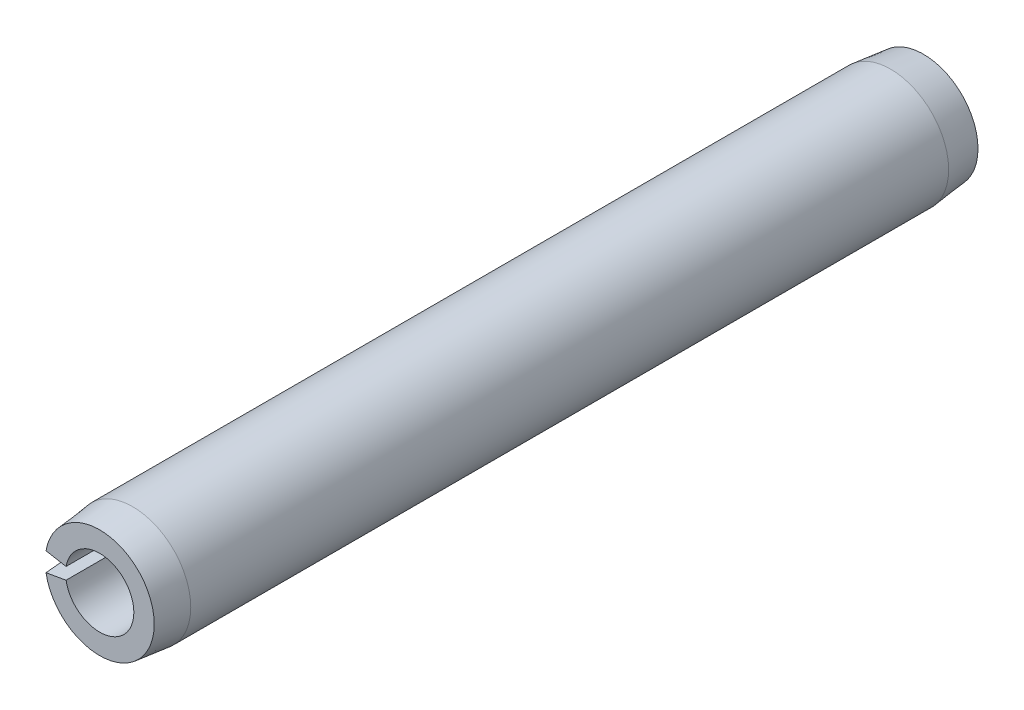
ISO-10303-21;
HEADER;
FILE_DESCRIPTION(('STEP AP214'),'2;1');
FILE_NAME('part.step','',(''),(''),'','','');
FILE_SCHEMA(('AUTOMOTIVE_DESIGN { 1 0 10303 214 1 1 1 1 }'));
ENDSEC;
DATA;
#1=APPLICATION_CONTEXT('core data for automotive mechanical design processes');
#2=APPLICATION_PROTOCOL_DEFINITION('international standard','automotive_design',2000,#1);
#3=PRODUCT_CONTEXT('',#1,'mechanical');
#4=PRODUCT('Part','Part','',(#3));
#5=PRODUCT_RELATED_PRODUCT_CATEGORY('part','',(#4));
#6=PRODUCT_DEFINITION_FORMATION('','',#4);
#7=PRODUCT_DEFINITION_CONTEXT('part definition',#1,'design');
#8=PRODUCT_DEFINITION('design','',#6,#7);
#9=PRODUCT_DEFINITION_SHAPE('','',#8);
#10=(LENGTH_UNIT() NAMED_UNIT(*) SI_UNIT(.MILLI.,.METRE.));
#11=(NAMED_UNIT(*) PLANE_ANGLE_UNIT() SI_UNIT($,.RADIAN.));
#12=(NAMED_UNIT(*) SI_UNIT($,.STERADIAN.) SOLID_ANGLE_UNIT());
#13=UNCERTAINTY_MEASURE_WITH_UNIT(LENGTH_MEASURE(1.E-05),#10,'distance_accuracy_value','');
#14=(GEOMETRIC_REPRESENTATION_CONTEXT(3) GLOBAL_UNCERTAINTY_ASSIGNED_CONTEXT((#13)) GLOBAL_UNIT_ASSIGNED_CONTEXT((#10,
#11,#12)) REPRESENTATION_CONTEXT('',''));
#15=CARTESIAN_POINT('',(0.,0.,0.));
#16=DIRECTION('',(0.,0.,1.));
#17=DIRECTION('',(1.,0.,0.));
#18=AXIS2_PLACEMENT_3D('',#15,#16,#17);
#19=CARTESIAN_POINT('',(0.,0.,17.4625));
#20=DIRECTION('',(0.,0.,1.));
#21=DIRECTION('',(1.,0.,0.));
#22=AXIS2_PLACEMENT_3D('',#19,#20,#21);
#23=PLANE('',#22);
#24=CARTESIAN_POINT('',(0.,0.,17.4625));
#25=DIRECTION('',(0.,0.,-1.));
#26=DIRECTION('',(-1.,0.,0.));
#27=AXIS2_PLACEMENT_3D('',#24,#25,#26);
#28=CIRCLE('',#27,2.3114);
#29=CARTESIAN_POINT('',(-2.27628464031242,0.401370397859335,17.4625));
#30=VERTEX_POINT('',#29);
#31=CARTESIAN_POINT('',(-2.27628464031242,-0.401370397859336,17.4625));
#32=VERTEX_POINT('',#31);
#33=EDGE_CURVE('E142',#30,#32,#28,.T.);
#34=ORIENTED_EDGE('',*,*,#33,.F.);
#35=DIRECTION('',(0.984807753012209,-0.173648177666927,0.));
#36=VECTOR('',#35,1.);
#37=CARTESIAN_POINT('',(-2.42636934187148,0.427834380135774,17.4625));
#38=LINE('',#37,#36);
#39=CARTESIAN_POINT('',(-1.42580466481108,0.251407831626177,17.4625));
#40=VERTEX_POINT('',#39);
#41=EDGE_CURVE('E166',#30,#40,#38,.T.);
#42=ORIENTED_EDGE('',*,*,#41,.T.);
#43=CARTESIAN_POINT('',(0.,0.,17.4625));
#44=DIRECTION('',(0.,0.,-1.));
#45=DIRECTION('',(1.,0.,0.));
#46=AXIS2_PLACEMENT_3D('',#43,#44,#45);
#47=CIRCLE('',#46,1.4478);
#48=CARTESIAN_POINT('',(-1.42580466481108,-0.251407831626177,17.4625));
#49=VERTEX_POINT('',#48);
#50=EDGE_CURVE('E164',#40,#49,#47,.T.);
#51=ORIENTED_EDGE('',*,*,#50,.T.);
#52=DIRECTION('',(-0.984807753012209,-0.173648177666927,0.));
#53=VECTOR('',#52,1.);
#54=CARTESIAN_POINT('',(-1.42580466481108,-0.251407831626177,17.4625));
#55=LINE('',#54,#53);
#56=EDGE_CURVE('E157',#49,#32,#55,.T.);
#57=ORIENTED_EDGE('',*,*,#56,.T.);
#58=EDGE_LOOP('',(#34,#42,#51,#57));
#59=FACE_BOUND('',#58,.T.);
#60=ADVANCED_FACE('F83',(#59),#23,.T.);
#61=CARTESIAN_POINT('',(0.,0.,-17.4625));
#62=DIRECTION('',(0.,0.,1.));
#63=DIRECTION('',(1.,0.,0.));
#64=AXIS2_PLACEMENT_3D('',#61,#62,#63);
#65=CYLINDRICAL_SURFACE('',#64,1.4478);
#66=DIRECTION('',(0.,0.,1.));
#67=VECTOR('',#66,1.);
#68=CARTESIAN_POINT('',(-1.42580466481108,-0.251407831626177,-17.4625));
#69=LINE('',#68,#67);
#70=CARTESIAN_POINT('',(-1.42580466481108,-0.251407831626177,-17.4625));
#71=VERTEX_POINT('',#70);
#72=EDGE_CURVE('E87',#71,#49,#69,.T.);
#73=ORIENTED_EDGE('',*,*,#72,.T.);
#74=ORIENTED_EDGE('',*,*,#50,.F.);
#75=DIRECTION('',(0.,0.,1.));
#76=VECTOR('',#75,1.);
#77=CARTESIAN_POINT('',(-1.42580466481108,0.251407831626177,-17.4625));
#78=LINE('',#77,#76);
#79=CARTESIAN_POINT('',(-1.42580466481108,0.251407831626177,-17.4625));
#80=VERTEX_POINT('',#79);
#81=EDGE_CURVE('E14',#80,#40,#78,.T.);
#82=ORIENTED_EDGE('',*,*,#81,.F.);
#83=CARTESIAN_POINT('',(0.,0.,-17.4625));
#84=DIRECTION('',(0.,0.,-1.));
#85=DIRECTION('',(1.,0.,0.));
#86=AXIS2_PLACEMENT_3D('',#83,#84,#85);
#87=CIRCLE('',#86,1.4478);
#88=EDGE_CURVE('E169',#80,#71,#87,.T.);
#89=ORIENTED_EDGE('',*,*,#88,.T.);
#90=EDGE_LOOP('',(#73,#74,#82,#89));
#91=FACE_BOUND('',#90,.T.);
#92=ADVANCED_FACE('F85',(#91),#65,.F.);
#93=CARTESIAN_POINT('',(-2.42636934187148,0.427834380135774,-17.4625));
#94=DIRECTION('',(-0.173648177666927,-0.984807753012209,0.));
#95=DIRECTION('',(0.984807753012209,-0.173648177666927,0.));
#96=AXIS2_PLACEMENT_3D('',#93,#94,#95);
#97=PLANE('',#96);
#98=DIRECTION('',(-0.106799948815622,0.0188317125144768,-0.994102176607995));
#99=VECTOR('',#98,1.);
#100=CARTESIAN_POINT('',(0.,0.,38.6503333333333));
#101=LINE('',#100,#99);
#102=CARTESIAN_POINT('',(-2.42636934187148,0.427834380135775,16.0655));
#103=VERTEX_POINT('',#102);
#104=EDGE_CURVE('E104',#103,#30,#101,.F.);
#105=ORIENTED_EDGE('',*,*,#104,.F.);
#106=DIRECTION('',(0.,0.,1.));
#107=VECTOR('',#106,1.);
#108=CARTESIAN_POINT('',(-2.42636934187148,0.427834380135774,-17.4625));
#109=LINE('',#108,#107);
#110=CARTESIAN_POINT('',(-2.42636934187148,0.427834380135775,-16.0655));
#111=VERTEX_POINT('',#110);
#112=EDGE_CURVE('E93',#111,#103,#109,.T.);
#113=ORIENTED_EDGE('',*,*,#112,.F.);
#114=DIRECTION('',(0.106799948815622,-0.0188317125144768,-0.994102176607995));
#115=VECTOR('',#114,1.);
#116=CARTESIAN_POINT('',(0.,0.,-38.6503333333333));
#117=LINE('',#116,#115);
#118=CARTESIAN_POINT('',(-2.27628464031242,0.401370397859335,-17.4625));
#119=VERTEX_POINT('',#118);
#120=EDGE_CURVE('E172',#119,#111,#117,.F.);
#121=ORIENTED_EDGE('',*,*,#120,.F.);
#122=DIRECTION('',(0.984807753012209,-0.173648177666927,0.));
#123=VECTOR('',#122,1.);
#124=CARTESIAN_POINT('',(-2.42636934187148,0.427834380135774,-17.4625));
#125=LINE('',#124,#123);
#126=EDGE_CURVE('E181',#119,#80,#125,.T.);
#127=ORIENTED_EDGE('',*,*,#126,.T.);
#128=ORIENTED_EDGE('',*,*,#81,.T.);
#129=ORIENTED_EDGE('',*,*,#41,.F.);
#130=EDGE_LOOP('',(#105,#113,#121,#127,#128,#129));
#131=FACE_BOUND('',#130,.T.);
#132=ADVANCED_FACE('F209',(#131),#97,.T.);
#133=CARTESIAN_POINT('',(0.,0.,-17.4625));
#134=DIRECTION('',(0.,0.,1.));
#135=DIRECTION('',(1.,0.,0.));
#136=AXIS2_PLACEMENT_3D('',#133,#134,#135);
#137=CYLINDRICAL_SURFACE('',#136,2.4638);
#138=CARTESIAN_POINT('',(0.,0.,16.0655));
#139=DIRECTION('',(0.,0.,-1.));
#140=DIRECTION('',(-1.,0.,0.));
#141=AXIS2_PLACEMENT_3D('',#138,#139,#140);
#142=CIRCLE('',#141,2.4638);
#143=CARTESIAN_POINT('',(-2.42636934187148,-0.427834380135775,16.0655));
#144=VERTEX_POINT('',#143);
#145=EDGE_CURVE('E151',#103,#144,#142,.T.);
#146=ORIENTED_EDGE('',*,*,#145,.T.);
#147=DIRECTION('',(0.,0.,1.));
#148=VECTOR('',#147,1.);
#149=CARTESIAN_POINT('',(-2.42636934187148,-0.427834380135775,-17.4625));
#150=LINE('',#149,#148);
#151=CARTESIAN_POINT('',(-2.42636934187148,-0.427834380135775,-16.0655));
#152=VERTEX_POINT('',#151);
#153=EDGE_CURVE('E160',#152,#144,#150,.T.);
#154=ORIENTED_EDGE('',*,*,#153,.F.);
#155=CARTESIAN_POINT('',(0.,0.,-16.0655));
#156=DIRECTION('',(0.,0.,-1.));
#157=DIRECTION('',(-1.,0.,0.));
#158=AXIS2_PLACEMENT_3D('',#155,#156,#157);
#159=CIRCLE('',#158,2.4638);
#160=EDGE_CURVE('E196',#111,#152,#159,.T.);
#161=ORIENTED_EDGE('',*,*,#160,.F.);
#162=ORIENTED_EDGE('',*,*,#112,.T.);
#163=EDGE_LOOP('',(#146,#154,#161,#162));
#164=FACE_BOUND('',#163,.T.);
#165=ADVANCED_FACE('F208',(#164),#137,.T.);
#166=CARTESIAN_POINT('',(-1.42580466481108,-0.251407831626177,-17.4625));
#167=DIRECTION('',(-0.173648177666927,0.984807753012209,0.));
#168=DIRECTION('',(-0.984807753012209,-0.173648177666927,0.));
#169=AXIS2_PLACEMENT_3D('',#166,#167,#168);
#170=PLANE('',#169);
#171=DIRECTION('',(0.106799948815622,0.0188317125144769,0.994102176607995));
#172=VECTOR('',#171,1.);
#173=CARTESIAN_POINT('',(0.,0.,38.6503333333333));
#174=LINE('',#173,#172);
#175=EDGE_CURVE('E145',#32,#144,#174,.F.);
#176=ORIENTED_EDGE('',*,*,#175,.F.);
#177=ORIENTED_EDGE('',*,*,#56,.F.);
#178=ORIENTED_EDGE('',*,*,#72,.F.);
#179=DIRECTION('',(-0.984807753012209,-0.173648177666927,0.));
#180=VECTOR('',#179,1.);
#181=CARTESIAN_POINT('',(-1.42580466481108,-0.251407831626177,-17.4625));
#182=LINE('',#181,#180);
#183=CARTESIAN_POINT('',(-2.27628464031242,-0.401370397859336,-17.4625));
#184=VERTEX_POINT('',#183);
#185=EDGE_CURVE('E178',#71,#184,#182,.T.);
#186=ORIENTED_EDGE('',*,*,#185,.T.);
#187=DIRECTION('',(-0.106799948815622,-0.0188317125144769,0.994102176607995));
#188=VECTOR('',#187,1.);
#189=CARTESIAN_POINT('',(0.,0.,-38.6503333333333));
#190=LINE('',#189,#188);
#191=EDGE_CURVE('E112',#152,#184,#190,.F.);
#192=ORIENTED_EDGE('',*,*,#191,.F.);
#193=ORIENTED_EDGE('',*,*,#153,.T.);
#194=EDGE_LOOP('',(#176,#177,#178,#186,#192,#193));
#195=FACE_BOUND('',#194,.T.);
#196=ADVANCED_FACE('F156',(#195),#170,.T.);
#197=CARTESIAN_POINT('',(0.,0.,-17.4625));
#198=DIRECTION('',(0.,0.,1.));
#199=DIRECTION('',(1.,0.,0.));
#200=AXIS2_PLACEMENT_3D('',#197,#198,#199);
#201=PLANE('',#200);
#202=ORIENTED_EDGE('',*,*,#126,.F.);
#203=CARTESIAN_POINT('',(0.,0.,-17.4625));
#204=DIRECTION('',(0.,0.,-1.));
#205=DIRECTION('',(-1.,0.,0.));
#206=AXIS2_PLACEMENT_3D('',#203,#204,#205);
#207=CIRCLE('',#206,2.3114);
#208=EDGE_CURVE('E194',#119,#184,#207,.T.);
#209=ORIENTED_EDGE('',*,*,#208,.T.);
#210=ORIENTED_EDGE('',*,*,#185,.F.);
#211=ORIENTED_EDGE('',*,*,#88,.F.);
#212=EDGE_LOOP('',(#202,#209,#210,#211));
#213=FACE_BOUND('',#212,.T.);
#214=ADVANCED_FACE('F193',(#213),#201,.F.);
#215=CARTESIAN_POINT('',(0.,0.,-16.0655));
#216=DIRECTION('',(0.,0.,1.));
#217=DIRECTION('',(1.,0.,0.));
#218=AXIS2_PLACEMENT_3D('',#215,#216,#217);
#219=CONICAL_SURFACE('',#218,2.4638,0.108661215840588);
#220=ORIENTED_EDGE('',*,*,#120,.T.);
#221=ORIENTED_EDGE('',*,*,#160,.T.);
#222=ORIENTED_EDGE('',*,*,#191,.T.);
#223=ORIENTED_EDGE('',*,*,#208,.F.);
#224=EDGE_LOOP('',(#220,#221,#222,#223));
#225=FACE_BOUND('',#224,.T.);
#226=ADVANCED_FACE('F204',(#225),#219,.T.);
#227=CARTESIAN_POINT('',(0.,0.,16.0655));
#228=DIRECTION('',(0.,0.,-1.));
#229=DIRECTION('',(1.,0.,0.));
#230=AXIS2_PLACEMENT_3D('',#227,#228,#229);
#231=CONICAL_SURFACE('',#230,2.4638,0.108661215840588);
#232=ORIENTED_EDGE('',*,*,#104,.T.);
#233=ORIENTED_EDGE('',*,*,#33,.T.);
#234=ORIENTED_EDGE('',*,*,#175,.T.);
#235=ORIENTED_EDGE('',*,*,#145,.F.);
#236=EDGE_LOOP('',(#232,#233,#234,#235));
#237=FACE_BOUND('',#236,.T.);
#238=ADVANCED_FACE('F144',(#237),#231,.T.);
#239=CLOSED_SHELL('',(#60,#92,#132,#165,#196,#214,#226,#238));
#240=MANIFOLD_SOLID_BREP('B2',#239);
#241=ADVANCED_BREP_SHAPE_REPRESENTATION('',(#18,#240),#14);
#242=SHAPE_DEFINITION_REPRESENTATION(#9,#241);
ENDSEC;
END-ISO-10303-21;
